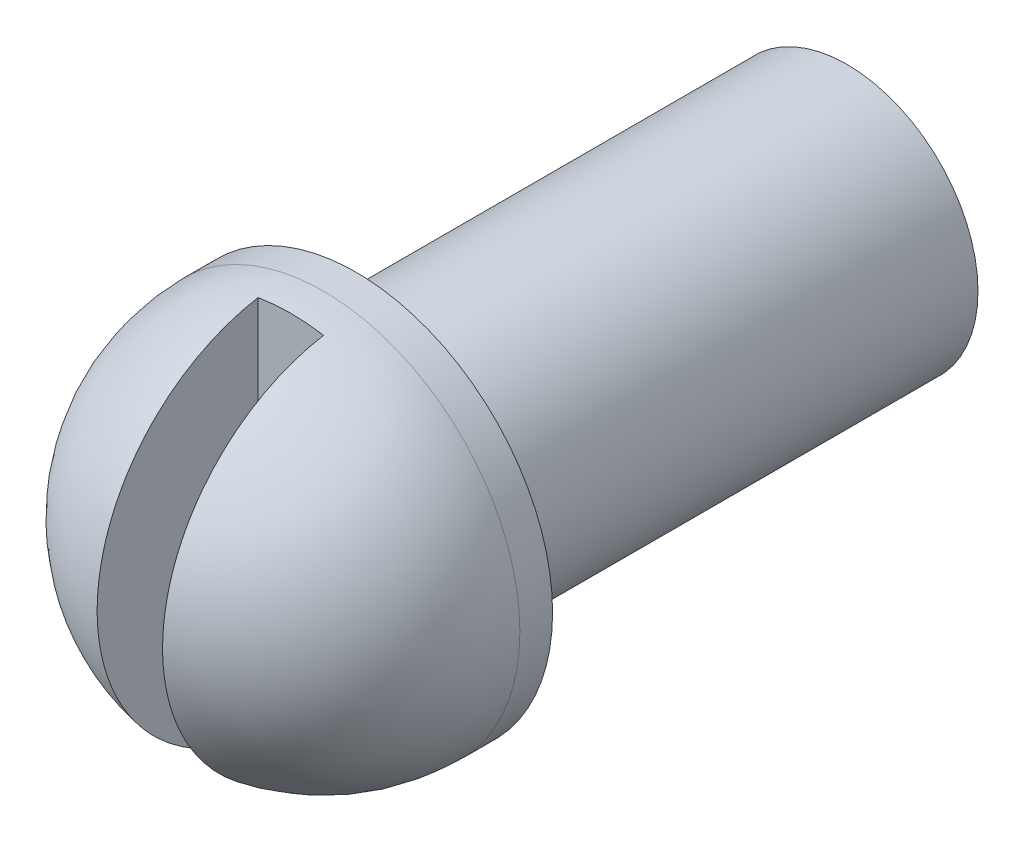
ISO-10303-21;
HEADER;
FILE_DESCRIPTION(('STEP AP214'),'2;1');
FILE_NAME('part.step','',(''),(''),'','','');
FILE_SCHEMA(('AUTOMOTIVE_DESIGN { 1 0 10303 214 1 1 1 1 }'));
ENDSEC;
DATA;
#1=APPLICATION_CONTEXT('core data for automotive mechanical design processes');
#2=APPLICATION_PROTOCOL_DEFINITION('international standard','automotive_design',2000,#1);
#3=PRODUCT_CONTEXT('',#1,'mechanical');
#4=PRODUCT('Part','Part','',(#3));
#5=PRODUCT_RELATED_PRODUCT_CATEGORY('part','',(#4));
#6=PRODUCT_DEFINITION_FORMATION('','',#4);
#7=PRODUCT_DEFINITION_CONTEXT('part definition',#1,'design');
#8=PRODUCT_DEFINITION('design','',#6,#7);
#9=PRODUCT_DEFINITION_SHAPE('','',#8);
#10=(LENGTH_UNIT() NAMED_UNIT(*) SI_UNIT(.MILLI.,.METRE.));
#11=(NAMED_UNIT(*) PLANE_ANGLE_UNIT() SI_UNIT($,.RADIAN.));
#12=(NAMED_UNIT(*) SI_UNIT($,.STERADIAN.) SOLID_ANGLE_UNIT());
#13=UNCERTAINTY_MEASURE_WITH_UNIT(LENGTH_MEASURE(1.E-05),#10,'distance_accuracy_value','');
#14=(GEOMETRIC_REPRESENTATION_CONTEXT(3) GLOBAL_UNCERTAINTY_ASSIGNED_CONTEXT((#13)) GLOBAL_UNIT_ASSIGNED_CONTEXT((#10,
#11,#12)) REPRESENTATION_CONTEXT('',''));
#15=CARTESIAN_POINT('',(0.,0.,0.));
#16=DIRECTION('',(0.,0.,1.));
#17=DIRECTION('',(1.,0.,0.));
#18=AXIS2_PLACEMENT_3D('',#15,#16,#17);
#19=CARTESIAN_POINT('',(0.,0.,16.));
#20=DIRECTION('',(0.,0.,1.));
#21=DIRECTION('',(1.,0.,0.));
#22=AXIS2_PLACEMENT_3D('',#19,#20,#21);
#23=SPHERICAL_SURFACE('',#22,6.);
#24=CARTESIAN_POINT('',(0.,0.,16.));
#25=DIRECTION('',(0.,0.,1.));
#26=DIRECTION('',(1.,0.,0.));
#27=AXIS2_PLACEMENT_3D('',#24,#25,#26);
#28=CIRCLE('',#27,6.);
#29=CARTESIAN_POINT('',(6.,0.,16.));
#30=VERTEX_POINT('',#29);
#31=EDGE_CURVE('E71',#30,#30,#28,.T.);
#32=ORIENTED_EDGE('',*,*,#31,.T.);
#33=EDGE_LOOP('',(#32));
#34=FACE_BOUND('',#33,.T.);
#35=CARTESIAN_POINT('',(1.,0.,16.));
#36=DIRECTION('',(1.,0.,0.));
#37=DIRECTION('',(0.,1.,0.));
#38=AXIS2_PLACEMENT_3D('',#35,#36,#37);
#39=CIRCLE('',#38,5.91607978309962);
#40=CARTESIAN_POINT('',(1.,-5.8309518948453,17.));
#41=VERTEX_POINT('',#40);
#42=CARTESIAN_POINT('',(0.999999999999999,5.8309518948453,17.));
#43=VERTEX_POINT('',#42);
#44=EDGE_CURVE('E64',#41,#43,#39,.F.);
#45=ORIENTED_EDGE('',*,*,#44,.F.);
#46=CARTESIAN_POINT('',(0.,0.,17.));
#47=DIRECTION('',(0.,0.,1.));
#48=DIRECTION('',(1.,0.,0.));
#49=AXIS2_PLACEMENT_3D('',#46,#47,#48);
#50=CIRCLE('',#49,5.91607978309962);
#51=CARTESIAN_POINT('',(-0.999999999999999,-5.8309518948453,17.));
#52=VERTEX_POINT('',#51);
#53=EDGE_CURVE('E11',#41,#52,#50,.F.);
#54=ORIENTED_EDGE('',*,*,#53,.T.);
#55=CARTESIAN_POINT('',(-1.,0.,16.));
#56=DIRECTION('',(-1.,0.,0.));
#57=DIRECTION('',(0.,-1.,0.));
#58=AXIS2_PLACEMENT_3D('',#55,#56,#57);
#59=CIRCLE('',#58,5.91607978309962);
#60=CARTESIAN_POINT('',(-1.,5.8309518948453,17.));
#61=VERTEX_POINT('',#60);
#62=EDGE_CURVE('E36',#61,#52,#59,.F.);
#63=ORIENTED_EDGE('',*,*,#62,.F.);
#64=EDGE_CURVE('E42',#61,#43,#50,.F.);
#65=ORIENTED_EDGE('',*,*,#64,.T.);
#66=EDGE_LOOP('',(#45,#54,#63,#65));
#67=FACE_BOUND('',#66,.T.);
#68=ADVANCED_FACE('F33',(#34,#67),#23,.T.);
#69=CARTESIAN_POINT('',(0.,0.,15.));
#70=DIRECTION('',(0.,0.,-1.));
#71=DIRECTION('',(-1.,0.,0.));
#72=AXIS2_PLACEMENT_3D('',#69,#70,#71);
#73=CYLINDRICAL_SURFACE('',#72,4.);
#74=CARTESIAN_POINT('',(0.,0.,15.));
#75=DIRECTION('',(0.,0.,1.));
#76=DIRECTION('',(1.,0.,0.));
#77=AXIS2_PLACEMENT_3D('',#74,#75,#76);
#78=CIRCLE('',#77,4.);
#79=CARTESIAN_POINT('',(4.,0.,15.));
#80=VERTEX_POINT('',#79);
#81=EDGE_CURVE('E65',#80,#80,#78,.T.);
#82=ORIENTED_EDGE('',*,*,#81,.F.);
#83=EDGE_LOOP('',(#82));
#84=FACE_BOUND('',#83,.T.);
#85=CARTESIAN_POINT('',(0.,0.,0.));
#86=DIRECTION('',(0.,0.,1.));
#87=DIRECTION('',(1.,0.,0.));
#88=AXIS2_PLACEMENT_3D('',#85,#86,#87);
#89=CIRCLE('',#88,4.);
#90=CARTESIAN_POINT('',(4.,0.,0.));
#91=VERTEX_POINT('',#90);
#92=EDGE_CURVE('E74',#91,#91,#89,.T.);
#93=ORIENTED_EDGE('',*,*,#92,.T.);
#94=EDGE_LOOP('',(#93));
#95=FACE_BOUND('',#94,.T.);
#96=ADVANCED_FACE('F93',(#84,#95),#73,.T.);
#97=CARTESIAN_POINT('',(0.,0.,0.));
#98=DIRECTION('',(0.,0.,1.));
#99=DIRECTION('',(1.,0.,0.));
#100=AXIS2_PLACEMENT_3D('',#97,#98,#99);
#101=PLANE('',#100);
#102=ORIENTED_EDGE('',*,*,#92,.F.);
#103=EDGE_LOOP('',(#102));
#104=FACE_BOUND('',#103,.T.);
#105=ADVANCED_FACE('F89',(#104),#101,.F.);
#106=CARTESIAN_POINT('',(0.,0.,15.));
#107=DIRECTION('',(0.,0.,1.));
#108=DIRECTION('',(1.,0.,0.));
#109=AXIS2_PLACEMENT_3D('',#106,#107,#108);
#110=PLANE('',#109);
#111=CARTESIAN_POINT('',(0.,0.,15.));
#112=DIRECTION('',(0.,0.,1.));
#113=DIRECTION('',(1.,0.,0.));
#114=AXIS2_PLACEMENT_3D('',#111,#112,#113);
#115=CIRCLE('',#114,6.);
#116=CARTESIAN_POINT('',(6.,0.,15.));
#117=VERTEX_POINT('',#116);
#118=EDGE_CURVE('E75',#117,#117,#115,.T.);
#119=ORIENTED_EDGE('',*,*,#118,.F.);
#120=EDGE_LOOP('',(#119));
#121=FACE_BOUND('',#120,.T.);
#122=ORIENTED_EDGE('',*,*,#81,.T.);
#123=EDGE_LOOP('',(#122));
#124=FACE_BOUND('',#123,.T.);
#125=ADVANCED_FACE('F86',(#121,#124),#110,.F.);
#126=CARTESIAN_POINT('',(0.,0.,16.));
#127=DIRECTION('',(0.,0.,-1.));
#128=DIRECTION('',(-1.,0.,0.));
#129=AXIS2_PLACEMENT_3D('',#126,#127,#128);
#130=CYLINDRICAL_SURFACE('',#129,6.);
#131=ORIENTED_EDGE('',*,*,#31,.F.);
#132=EDGE_LOOP('',(#131));
#133=FACE_BOUND('',#132,.T.);
#134=ORIENTED_EDGE('',*,*,#118,.T.);
#135=EDGE_LOOP('',(#134));
#136=FACE_BOUND('',#135,.T.);
#137=ADVANCED_FACE('F84',(#133,#136),#130,.T.);
#138=CARTESIAN_POINT('',(-1.,6.23977672836833,17.));
#139=DIRECTION('',(-1.,0.,0.));
#140=DIRECTION('',(0.,-1.,0.));
#141=AXIS2_PLACEMENT_3D('',#138,#139,#140);
#142=PLANE('',#141);
#143=ORIENTED_EDGE('',*,*,#62,.T.);
#144=DIRECTION('',(0.,-1.,0.));
#145=VECTOR('',#144,1.);
#146=CARTESIAN_POINT('',(-1.,6.23977672836833,17.));
#147=LINE('',#146,#145);
#148=EDGE_CURVE('E60',#61,#52,#147,.T.);
#149=ORIENTED_EDGE('',*,*,#148,.F.);
#150=EDGE_LOOP('',(#143,#149));
#151=FACE_BOUND('',#150,.T.);
#152=ADVANCED_FACE('F67',(#151),#142,.F.);
#153=CARTESIAN_POINT('',(0.999999999999999,6.23977672836833,17.));
#154=DIRECTION('',(1.,0.,0.));
#155=DIRECTION('',(0.,1.,0.));
#156=AXIS2_PLACEMENT_3D('',#153,#154,#155);
#157=PLANE('',#156);
#158=ORIENTED_EDGE('',*,*,#44,.T.);
#159=DIRECTION('',(0.,1.,0.));
#160=VECTOR('',#159,1.);
#161=CARTESIAN_POINT('',(0.999999999999999,6.23977672836833,17.));
#162=LINE('',#161,#160);
#163=EDGE_CURVE('E49',#41,#43,#162,.T.);
#164=ORIENTED_EDGE('',*,*,#163,.F.);
#165=EDGE_LOOP('',(#158,#164));
#166=FACE_BOUND('',#165,.T.);
#167=ADVANCED_FACE('F113',(#166),#157,.F.);
#168=CARTESIAN_POINT('',(0.,0.,17.));
#169=DIRECTION('',(0.,0.,1.));
#170=DIRECTION('',(1.,0.,0.));
#171=AXIS2_PLACEMENT_3D('',#168,#169,#170);
#172=PLANE('',#171);
#173=ORIENTED_EDGE('',*,*,#163,.T.);
#174=ORIENTED_EDGE('',*,*,#64,.F.);
#175=ORIENTED_EDGE('',*,*,#148,.T.);
#176=ORIENTED_EDGE('',*,*,#53,.F.);
#177=EDGE_LOOP('',(#173,#174,#175,#176));
#178=FACE_BOUND('',#177,.T.);
#179=ADVANCED_FACE('F59',(#178),#172,.T.);
#180=CLOSED_SHELL('',(#68,#96,#105,#125,#137,#152,#167,#179));
#181=MANIFOLD_SOLID_BREP('B2',#180);
#182=ADVANCED_BREP_SHAPE_REPRESENTATION('',(#18,#181),#14);
#183=SHAPE_DEFINITION_REPRESENTATION(#9,#182);
ENDSEC;
END-ISO-10303-21;
